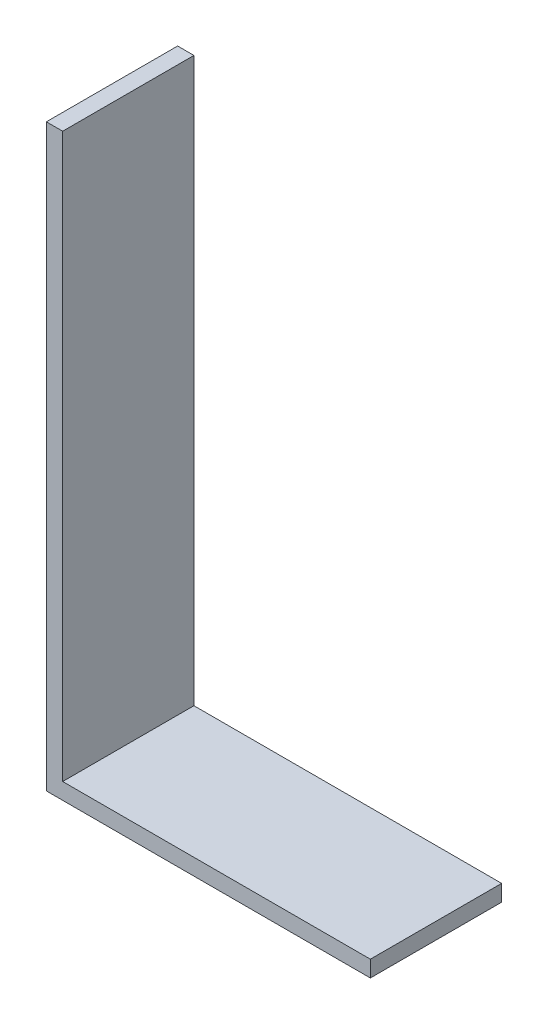
ISO-10303-21;
HEADER;
FILE_DESCRIPTION(('STEP AP214'),'2;1');
FILE_NAME('part.step','',(''),(''),'','','');
FILE_SCHEMA(('AUTOMOTIVE_DESIGN { 1 0 10303 214 1 1 1 1 }'));
ENDSEC;
DATA;
#1=APPLICATION_CONTEXT('core data for automotive mechanical design processes');
#2=APPLICATION_PROTOCOL_DEFINITION('international standard','automotive_design',2000,#1);
#3=PRODUCT_CONTEXT('',#1,'mechanical');
#4=PRODUCT('Part','Part','',(#3));
#5=PRODUCT_RELATED_PRODUCT_CATEGORY('part','',(#4));
#6=PRODUCT_DEFINITION_FORMATION('','',#4);
#7=PRODUCT_DEFINITION_CONTEXT('part definition',#1,'design');
#8=PRODUCT_DEFINITION('design','',#6,#7);
#9=PRODUCT_DEFINITION_SHAPE('','',#8);
#10=(LENGTH_UNIT() NAMED_UNIT(*) SI_UNIT(.MILLI.,.METRE.));
#11=(NAMED_UNIT(*) PLANE_ANGLE_UNIT() SI_UNIT($,.RADIAN.));
#12=(NAMED_UNIT(*) SI_UNIT($,.STERADIAN.) SOLID_ANGLE_UNIT());
#13=UNCERTAINTY_MEASURE_WITH_UNIT(LENGTH_MEASURE(1.E-05),#10,'distance_accuracy_value','');
#14=(GEOMETRIC_REPRESENTATION_CONTEXT(3) GLOBAL_UNCERTAINTY_ASSIGNED_CONTEXT((#13)) GLOBAL_UNIT_ASSIGNED_CONTEXT((#10,
#11,#12)) REPRESENTATION_CONTEXT('',''));
#15=CARTESIAN_POINT('',(0.,0.,0.));
#16=DIRECTION('',(0.,0.,1.));
#17=DIRECTION('',(1.,0.,0.));
#18=AXIS2_PLACEMENT_3D('',#15,#16,#17);
#19=CARTESIAN_POINT('',(6.31000000000016,6.3099999999999,50.8));
#20=DIRECTION('',(0.,-1.,0.));
#21=DIRECTION('',(0.,0.,-1.));
#22=AXIS2_PLACEMENT_3D('',#19,#20,#21);
#23=PLANE('',#22);
#24=DIRECTION('',(-1.,0.,0.));
#25=VECTOR('',#24,1.);
#26=CARTESIAN_POINT('',(6.31000000000016,6.3099999999999,0.));
#27=LINE('',#26,#25);
#28=CARTESIAN_POINT('',(125.365,6.3099999999999,0.));
#29=VERTEX_POINT('',#28);
#30=CARTESIAN_POINT('',(6.31000000000016,6.3099999999999,0.));
#31=VERTEX_POINT('',#30);
#32=EDGE_CURVE('E117',#29,#31,#27,.T.);
#33=ORIENTED_EDGE('',*,*,#32,.T.);
#34=DIRECTION('',(0.,0.,-1.));
#35=VECTOR('',#34,1.);
#36=CARTESIAN_POINT('',(6.31000000000016,6.3099999999999,50.8));
#37=LINE('',#36,#35);
#38=CARTESIAN_POINT('',(6.31000000000016,6.3099999999999,50.8));
#39=VERTEX_POINT('',#38);
#40=EDGE_CURVE('E11',#39,#31,#37,.T.);
#41=ORIENTED_EDGE('',*,*,#40,.F.);
#42=DIRECTION('',(-1.,0.,0.));
#43=VECTOR('',#42,1.);
#44=CARTESIAN_POINT('',(6.31000000000016,6.3099999999999,50.8));
#45=LINE('',#44,#43);
#46=CARTESIAN_POINT('',(125.365,6.3099999999999,50.8));
#47=VERTEX_POINT('',#46);
#48=EDGE_CURVE('E127',#47,#39,#45,.T.);
#49=ORIENTED_EDGE('',*,*,#48,.F.);
#50=DIRECTION('',(0.,0.,-1.));
#51=VECTOR('',#50,1.);
#52=CARTESIAN_POINT('',(125.365,6.3099999999999,50.8));
#53=LINE('',#52,#51);
#54=EDGE_CURVE('E113',#47,#29,#53,.T.);
#55=ORIENTED_EDGE('',*,*,#54,.T.);
#56=EDGE_LOOP('',(#33,#41,#49,#55));
#57=FACE_BOUND('',#56,.T.);
#58=ADVANCED_FACE('F33',(#57),#23,.F.);
#59=CARTESIAN_POINT('',(6.31000000000013,224.21628726,50.8));
#60=DIRECTION('',(-1.,0.,0.));
#61=DIRECTION('',(0.,-1.,0.));
#62=AXIS2_PLACEMENT_3D('',#59,#60,#61);
#63=PLANE('',#62);
#64=DIRECTION('',(0.,1.,0.));
#65=VECTOR('',#64,1.);
#66=CARTESIAN_POINT('',(6.31000000000013,224.21628726,0.));
#67=LINE('',#66,#65);
#68=CARTESIAN_POINT('',(6.31000000000013,224.21628726,0.));
#69=VERTEX_POINT('',#68);
#70=EDGE_CURVE('E120',#31,#69,#67,.T.);
#71=ORIENTED_EDGE('',*,*,#70,.T.);
#72=DIRECTION('',(0.,0.,-1.));
#73=VECTOR('',#72,1.);
#74=CARTESIAN_POINT('',(6.31000000000013,224.21628726,50.8));
#75=LINE('',#74,#73);
#76=CARTESIAN_POINT('',(6.31000000000013,224.21628726,50.8));
#77=VERTEX_POINT('',#76);
#78=EDGE_CURVE('E41',#77,#69,#75,.T.);
#79=ORIENTED_EDGE('',*,*,#78,.F.);
#80=DIRECTION('',(0.,1.,0.));
#81=VECTOR('',#80,1.);
#82=CARTESIAN_POINT('',(6.31000000000013,224.21628726,50.8));
#83=LINE('',#82,#81);
#84=EDGE_CURVE('E86',#39,#77,#83,.T.);
#85=ORIENTED_EDGE('',*,*,#84,.F.);
#86=ORIENTED_EDGE('',*,*,#40,.T.);
#87=EDGE_LOOP('',(#71,#79,#85,#86));
#88=FACE_BOUND('',#87,.T.);
#89=ADVANCED_FACE('F151',(#88),#63,.F.);
#90=CARTESIAN_POINT('',(0.,224.21628726,50.8));
#91=DIRECTION('',(0.,-1.,0.));
#92=DIRECTION('',(0.,0.,-1.));
#93=AXIS2_PLACEMENT_3D('',#90,#91,#92);
#94=PLANE('',#93);
#95=DIRECTION('',(-1.,0.,0.));
#96=VECTOR('',#95,1.);
#97=CARTESIAN_POINT('',(0.,224.21628726,0.));
#98=LINE('',#97,#96);
#99=CARTESIAN_POINT('',(0.,224.21628726,0.));
#100=VERTEX_POINT('',#99);
#101=EDGE_CURVE('E122',#69,#100,#98,.T.);
#102=ORIENTED_EDGE('',*,*,#101,.T.);
#103=DIRECTION('',(0.,0.,-1.));
#104=VECTOR('',#103,1.);
#105=CARTESIAN_POINT('',(0.,224.21628726,50.8));
#106=LINE('',#105,#104);
#107=CARTESIAN_POINT('',(0.,224.21628726,50.8));
#108=VERTEX_POINT('',#107);
#109=EDGE_CURVE('E108',#108,#100,#106,.T.);
#110=ORIENTED_EDGE('',*,*,#109,.F.);
#111=DIRECTION('',(-1.,0.,0.));
#112=VECTOR('',#111,1.);
#113=CARTESIAN_POINT('',(0.,224.21628726,50.8));
#114=LINE('',#113,#112);
#115=EDGE_CURVE('E99',#77,#108,#114,.T.);
#116=ORIENTED_EDGE('',*,*,#115,.F.);
#117=ORIENTED_EDGE('',*,*,#78,.T.);
#118=EDGE_LOOP('',(#102,#110,#116,#117));
#119=FACE_BOUND('',#118,.T.);
#120=ADVANCED_FACE('F133',(#119),#94,.F.);
#121=CARTESIAN_POINT('',(0.,0.,50.8));
#122=DIRECTION('',(1.,0.,0.));
#123=DIRECTION('',(0.,0.,-1.));
#124=AXIS2_PLACEMENT_3D('',#121,#122,#123);
#125=PLANE('',#124);
#126=DIRECTION('',(0.,-1.,0.));
#127=VECTOR('',#126,1.);
#128=CARTESIAN_POINT('',(0.,0.,0.));
#129=LINE('',#128,#127);
#130=CARTESIAN_POINT('',(0.,0.,0.));
#131=VERTEX_POINT('',#130);
#132=EDGE_CURVE('E107',#100,#131,#129,.T.);
#133=ORIENTED_EDGE('',*,*,#132,.T.);
#134=DIRECTION('',(0.,0.,-1.));
#135=VECTOR('',#134,1.);
#136=CARTESIAN_POINT('',(0.,0.,50.8));
#137=LINE('',#136,#135);
#138=CARTESIAN_POINT('',(0.,0.,50.8));
#139=VERTEX_POINT('',#138);
#140=EDGE_CURVE('E104',#139,#131,#137,.T.);
#141=ORIENTED_EDGE('',*,*,#140,.F.);
#142=DIRECTION('',(0.,-1.,0.));
#143=VECTOR('',#142,1.);
#144=CARTESIAN_POINT('',(0.,0.,50.8));
#145=LINE('',#144,#143);
#146=EDGE_CURVE('E93',#108,#139,#145,.T.);
#147=ORIENTED_EDGE('',*,*,#146,.F.);
#148=ORIENTED_EDGE('',*,*,#109,.T.);
#149=EDGE_LOOP('',(#133,#141,#147,#148));
#150=FACE_BOUND('',#149,.T.);
#151=ADVANCED_FACE('F105',(#150),#125,.F.);
#152=CARTESIAN_POINT('',(125.365,0.,50.8));
#153=DIRECTION('',(0.,1.,0.));
#154=DIRECTION('',(0.,0.,1.));
#155=AXIS2_PLACEMENT_3D('',#152,#153,#154);
#156=PLANE('',#155);
#157=DIRECTION('',(1.,0.,0.));
#158=VECTOR('',#157,1.);
#159=CARTESIAN_POINT('',(125.365,0.,0.));
#160=LINE('',#159,#158);
#161=CARTESIAN_POINT('',(125.365,0.,0.));
#162=VERTEX_POINT('',#161);
#163=EDGE_CURVE('E72',#131,#162,#160,.T.);
#164=ORIENTED_EDGE('',*,*,#163,.T.);
#165=DIRECTION('',(0.,0.,-1.));
#166=VECTOR('',#165,1.);
#167=CARTESIAN_POINT('',(125.365,0.,50.8));
#168=LINE('',#167,#166);
#169=CARTESIAN_POINT('',(125.365,0.,50.8));
#170=VERTEX_POINT('',#169);
#171=EDGE_CURVE('E109',#170,#162,#168,.T.);
#172=ORIENTED_EDGE('',*,*,#171,.F.);
#173=DIRECTION('',(1.,0.,0.));
#174=VECTOR('',#173,1.);
#175=CARTESIAN_POINT('',(125.365,0.,50.8));
#176=LINE('',#175,#174);
#177=EDGE_CURVE('E97',#139,#170,#176,.T.);
#178=ORIENTED_EDGE('',*,*,#177,.F.);
#179=ORIENTED_EDGE('',*,*,#140,.T.);
#180=EDGE_LOOP('',(#164,#172,#178,#179));
#181=FACE_BOUND('',#180,.T.);
#182=ADVANCED_FACE('F111',(#181),#156,.F.);
#183=CARTESIAN_POINT('',(125.365,6.3099999999999,50.8));
#184=DIRECTION('',(-1.,0.,0.));
#185=DIRECTION('',(0.,0.,1.));
#186=AXIS2_PLACEMENT_3D('',#183,#184,#185);
#187=PLANE('',#186);
#188=DIRECTION('',(0.,1.,0.));
#189=VECTOR('',#188,1.);
#190=CARTESIAN_POINT('',(125.365,6.3099999999999,0.));
#191=LINE('',#190,#189);
#192=EDGE_CURVE('E78',#162,#29,#191,.T.);
#193=ORIENTED_EDGE('',*,*,#192,.T.);
#194=ORIENTED_EDGE('',*,*,#54,.F.);
#195=DIRECTION('',(0.,1.,0.));
#196=VECTOR('',#195,1.);
#197=CARTESIAN_POINT('',(125.365,6.3099999999999,50.8));
#198=LINE('',#197,#196);
#199=EDGE_CURVE('E49',#170,#47,#198,.T.);
#200=ORIENTED_EDGE('',*,*,#199,.F.);
#201=ORIENTED_EDGE('',*,*,#171,.T.);
#202=EDGE_LOOP('',(#193,#194,#200,#201));
#203=FACE_BOUND('',#202,.T.);
#204=ADVANCED_FACE('F140',(#203),#187,.F.);
#205=CARTESIAN_POINT('',(0.,0.,50.8));
#206=DIRECTION('',(0.,0.,-1.));
#207=DIRECTION('',(-1.,0.,0.));
#208=AXIS2_PLACEMENT_3D('',#205,#206,#207);
#209=PLANE('',#208);
#210=ORIENTED_EDGE('',*,*,#48,.T.);
#211=ORIENTED_EDGE('',*,*,#84,.T.);
#212=ORIENTED_EDGE('',*,*,#115,.T.);
#213=ORIENTED_EDGE('',*,*,#146,.T.);
#214=ORIENTED_EDGE('',*,*,#177,.T.);
#215=ORIENTED_EDGE('',*,*,#199,.T.);
#216=EDGE_LOOP('',(#210,#211,#212,#213,#214,#215));
#217=FACE_BOUND('',#216,.T.);
#218=ADVANCED_FACE('F95',(#217),#209,.F.);
#219=CARTESIAN_POINT('',(0.,0.,0.));
#220=DIRECTION('',(0.,0.,-1.));
#221=DIRECTION('',(-1.,0.,0.));
#222=AXIS2_PLACEMENT_3D('',#219,#220,#221);
#223=PLANE('',#222);
#224=ORIENTED_EDGE('',*,*,#32,.F.);
#225=ORIENTED_EDGE('',*,*,#192,.F.);
#226=ORIENTED_EDGE('',*,*,#163,.F.);
#227=ORIENTED_EDGE('',*,*,#132,.F.);
#228=ORIENTED_EDGE('',*,*,#101,.F.);
#229=ORIENTED_EDGE('',*,*,#70,.F.);
#230=EDGE_LOOP('',(#224,#225,#226,#227,#228,#229));
#231=FACE_BOUND('',#230,.T.);
#232=ADVANCED_FACE('F136',(#231),#223,.T.);
#233=CLOSED_SHELL('',(#58,#89,#120,#151,#182,#204,#218,#232));
#234=MANIFOLD_SOLID_BREP('B2',#233);
#235=ADVANCED_BREP_SHAPE_REPRESENTATION('',(#18,#234),#14);
#236=SHAPE_DEFINITION_REPRESENTATION(#9,#235);
ENDSEC;
END-ISO-10303-21;
